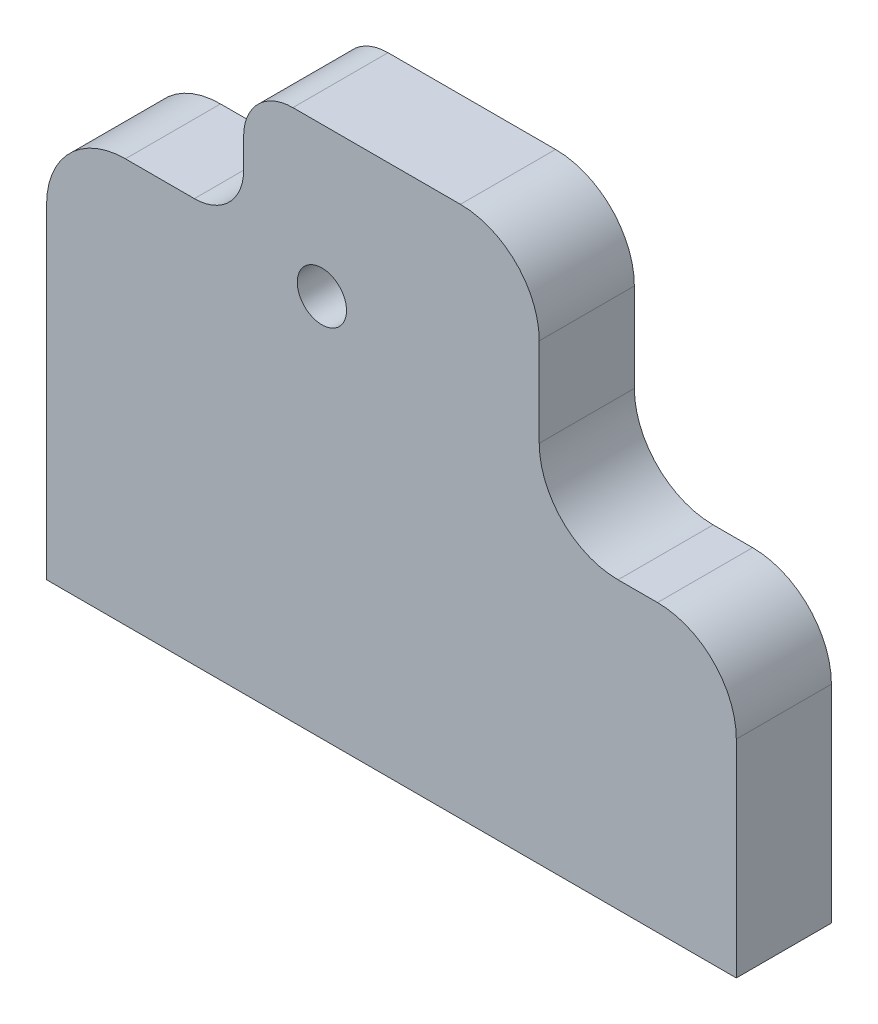
ISO-10303-21;
HEADER;
FILE_DESCRIPTION(('STEP AP214'),'2;1');
FILE_NAME('part.step','',(''),(''),'','','');
FILE_SCHEMA(('AUTOMOTIVE_DESIGN { 1 0 10303 214 1 1 1 1 }'));
ENDSEC;
DATA;
#1=APPLICATION_CONTEXT('core data for automotive mechanical design processes');
#2=APPLICATION_PROTOCOL_DEFINITION('international standard','automotive_design',2000,#1);
#3=PRODUCT_CONTEXT('',#1,'mechanical');
#4=PRODUCT('Part','Part','',(#3));
#5=PRODUCT_RELATED_PRODUCT_CATEGORY('part','',(#4));
#6=PRODUCT_DEFINITION_FORMATION('','',#4);
#7=PRODUCT_DEFINITION_CONTEXT('part definition',#1,'design');
#8=PRODUCT_DEFINITION('design','',#6,#7);
#9=PRODUCT_DEFINITION_SHAPE('','',#8);
#10=(LENGTH_UNIT() NAMED_UNIT(*) SI_UNIT(.MILLI.,.METRE.));
#11=(NAMED_UNIT(*) PLANE_ANGLE_UNIT() SI_UNIT($,.RADIAN.));
#12=(NAMED_UNIT(*) SI_UNIT($,.STERADIAN.) SOLID_ANGLE_UNIT());
#13=UNCERTAINTY_MEASURE_WITH_UNIT(LENGTH_MEASURE(1.E-05),#10,'distance_accuracy_value','');
#14=(GEOMETRIC_REPRESENTATION_CONTEXT(3) GLOBAL_UNCERTAINTY_ASSIGNED_CONTEXT((#13)) GLOBAL_UNIT_ASSIGNED_CONTEXT((#10,
#11,#12)) REPRESENTATION_CONTEXT('',''));
#15=CARTESIAN_POINT('',(0.,0.,0.));
#16=DIRECTION('',(0.,0.,1.));
#17=DIRECTION('',(1.,0.,0.));
#18=AXIS2_PLACEMENT_3D('',#15,#16,#17);
#19=CARTESIAN_POINT('',(16.73,5.,2.413));
#20=DIRECTION('',(0.,-1.,0.));
#21=DIRECTION('',(0.,0.,-1.));
#22=AXIS2_PLACEMENT_3D('',#19,#20,#21);
#23=CONICAL_SURFACE('',#22,1.25,1.02974425867665);
#24=CARTESIAN_POINT('',(16.73,5.75107577378445,2.413));
#25=VERTEX_POINT('',#24);
#26=VERTEX_LOOP('',#25);
#27=FACE_BOUND('',#26,.T.);
#28=CARTESIAN_POINT('',(16.73,5.,2.413));
#29=DIRECTION('',(0.,-1.,0.));
#30=DIRECTION('',(0.,0.,-1.));
#31=AXIS2_PLACEMENT_3D('',#28,#29,#30);
#32=CIRCLE('',#31,1.25);
#33=CARTESIAN_POINT('',(16.73,5.,1.163));
#34=VERTEX_POINT('',#33);
#35=EDGE_CURVE('E200',#34,#34,#32,.T.);
#36=ORIENTED_EDGE('',*,*,#35,.T.);
#37=EDGE_LOOP('',(#36));
#38=FACE_BOUND('',#37,.T.);
#39=ADVANCED_FACE('F49',(#27,#38),#23,.F.);
#40=CARTESIAN_POINT('',(16.73,0.,2.413));
#41=DIRECTION('',(0.,-1.,0.));
#42=DIRECTION('',(0.,0.,-1.));
#43=AXIS2_PLACEMENT_3D('',#40,#41,#42);
#44=CYLINDRICAL_SURFACE('',#43,1.24999999999999);
#45=ORIENTED_EDGE('',*,*,#35,.F.);
#46=EDGE_LOOP('',(#45));
#47=FACE_BOUND('',#46,.T.);
#48=CARTESIAN_POINT('',(16.73,-7.,2.413));
#49=DIRECTION('',(0.,-1.,0.));
#50=DIRECTION('',(1.,0.,0.));
#51=AXIS2_PLACEMENT_3D('',#48,#49,#50);
#52=CIRCLE('',#51,1.24999999999999);
#53=CARTESIAN_POINT('',(17.98,-7.,2.413));
#54=VERTEX_POINT('',#53);
#55=EDGE_CURVE('E192',#54,#54,#52,.T.);
#56=ORIENTED_EDGE('',*,*,#55,.T.);
#57=EDGE_LOOP('',(#56));
#58=FACE_BOUND('',#57,.T.);
#59=ADVANCED_FACE('F383',(#47,#58),#44,.F.);
#60=CARTESIAN_POINT('',(0.,-7.,0.));
#61=DIRECTION('',(0.,1.,0.));
#62=DIRECTION('',(-1.,0.,0.));
#63=AXIS2_PLACEMENT_3D('',#60,#61,#62);
#64=PLANE('',#63);
#65=DIRECTION('',(0.,0.,-1.));
#66=VECTOR('',#65,1.);
#67=CARTESIAN_POINT('',(0.,-7.,0.));
#68=LINE('',#67,#66);
#69=CARTESIAN_POINT('',(0.,-7.,4.826));
#70=VERTEX_POINT('',#69);
#71=CARTESIAN_POINT('',(0.,-7.,0.));
#72=VERTEX_POINT('',#71);
#73=EDGE_CURVE('E163',#70,#72,#68,.T.);
#74=ORIENTED_EDGE('',*,*,#73,.T.);
#75=DIRECTION('',(1.,0.,0.));
#76=VECTOR('',#75,1.);
#77=CARTESIAN_POINT('',(0.,-7.,0.));
#78=LINE('',#77,#76);
#79=CARTESIAN_POINT('',(35.,-7.,0.));
#80=VERTEX_POINT('',#79);
#81=EDGE_CURVE('E172',#72,#80,#78,.T.);
#82=ORIENTED_EDGE('',*,*,#81,.T.);
#83=DIRECTION('',(0.,0.,1.));
#84=VECTOR('',#83,1.);
#85=CARTESIAN_POINT('',(35.,-7.,0.));
#86=LINE('',#85,#84);
#87=CARTESIAN_POINT('',(35.,-7.,4.826));
#88=VERTEX_POINT('',#87);
#89=EDGE_CURVE('E180',#80,#88,#86,.T.);
#90=ORIENTED_EDGE('',*,*,#89,.T.);
#91=DIRECTION('',(-1.,0.,0.));
#92=VECTOR('',#91,1.);
#93=CARTESIAN_POINT('',(0.,-7.,4.826));
#94=LINE('',#93,#92);
#95=EDGE_CURVE('E186',#88,#70,#94,.T.);
#96=ORIENTED_EDGE('',*,*,#95,.T.);
#97=EDGE_LOOP('',(#74,#82,#90,#96));
#98=FACE_BOUND('',#97,.T.);
#99=CARTESIAN_POINT('',(28.73,-7.,2.413));
#100=DIRECTION('',(0.,-1.,0.));
#101=DIRECTION('',(1.,0.,0.));
#102=AXIS2_PLACEMENT_3D('',#99,#100,#101);
#103=CIRCLE('',#102,1.25);
#104=CARTESIAN_POINT('',(29.98,-7.,2.413));
#105=VERTEX_POINT('',#104);
#106=EDGE_CURVE('E188',#105,#105,#103,.T.);
#107=ORIENTED_EDGE('',*,*,#106,.F.);
#108=EDGE_LOOP('',(#107));
#109=FACE_BOUND('',#108,.T.);
#110=ORIENTED_EDGE('',*,*,#55,.F.);
#111=EDGE_LOOP('',(#110));
#112=FACE_BOUND('',#111,.T.);
#113=ADVANCED_FACE('F183',(#98,#109,#112),#64,.F.);
#114=CARTESIAN_POINT('',(0.,13.5,4.826));
#115=DIRECTION('',(0.,1.,0.));
#116=DIRECTION('',(0.,0.,1.));
#117=AXIS2_PLACEMENT_3D('',#114,#115,#116);
#118=PLANE('',#117);
#119=DIRECTION('',(1.,0.,0.));
#120=VECTOR('',#119,1.);
#121=CARTESIAN_POINT('',(0.,13.5,0.));
#122=LINE('',#121,#120);
#123=CARTESIAN_POINT('',(4.,13.5,0.));
#124=VERTEX_POINT('',#123);
#125=CARTESIAN_POINT('',(7.5,13.5,0.));
#126=VERTEX_POINT('',#125);
#127=EDGE_CURVE('E169',#124,#126,#122,.T.);
#128=ORIENTED_EDGE('',*,*,#127,.F.);
#129=DIRECTION('',(0.,0.,-1.));
#130=VECTOR('',#129,1.);
#131=CARTESIAN_POINT('',(4.,13.5,4.826));
#132=LINE('',#131,#130);
#133=CARTESIAN_POINT('',(4.,13.5,4.826));
#134=VERTEX_POINT('',#133);
#135=EDGE_CURVE('E326',#124,#134,#132,.F.);
#136=ORIENTED_EDGE('',*,*,#135,.T.);
#137=DIRECTION('',(1.,0.,0.));
#138=VECTOR('',#137,1.);
#139=CARTESIAN_POINT('',(0.,13.5,4.826));
#140=LINE('',#139,#138);
#141=CARTESIAN_POINT('',(7.5,13.5,4.826));
#142=VERTEX_POINT('',#141);
#143=EDGE_CURVE('E221',#134,#142,#140,.T.);
#144=ORIENTED_EDGE('',*,*,#143,.T.);
#145=DIRECTION('',(0.,0.,-1.));
#146=VECTOR('',#145,1.);
#147=CARTESIAN_POINT('',(7.5,13.5,0.));
#148=LINE('',#147,#146);
#149=EDGE_CURVE('E275',#142,#126,#148,.T.);
#150=ORIENTED_EDGE('',*,*,#149,.T.);
#151=EDGE_LOOP('',(#128,#136,#144,#150));
#152=FACE_BOUND('',#151,.T.);
#153=ADVANCED_FACE('F366',(#152),#118,.T.);
#154=CARTESIAN_POINT('',(7.5,16.,4.826));
#155=DIRECTION('',(0.,0.,1.));
#156=DIRECTION('',(1.,0.,0.));
#157=AXIS2_PLACEMENT_3D('',#154,#155,#156);
#158=CYLINDRICAL_SURFACE('',#157,2.5);
#159=CARTESIAN_POINT('',(7.5,16.,4.826));
#160=DIRECTION('',(0.,0.,1.));
#161=DIRECTION('',(1.,0.,0.));
#162=AXIS2_PLACEMENT_3D('',#159,#160,#161);
#163=CIRCLE('',#162,2.5);
#164=CARTESIAN_POINT('',(10.,16.,4.826));
#165=VERTEX_POINT('',#164);
#166=EDGE_CURVE('E282',#165,#142,#163,.F.);
#167=ORIENTED_EDGE('',*,*,#166,.F.);
#168=DIRECTION('',(0.,0.,-1.));
#169=VECTOR('',#168,1.);
#170=CARTESIAN_POINT('',(10.,16.,4.826));
#171=LINE('',#170,#169);
#172=CARTESIAN_POINT('',(10.,16.,0.));
#173=VERTEX_POINT('',#172);
#174=EDGE_CURVE('E242',#173,#165,#171,.F.);
#175=ORIENTED_EDGE('',*,*,#174,.F.);
#176=CARTESIAN_POINT('',(7.5,16.,0.));
#177=DIRECTION('',(0.,0.,1.));
#178=DIRECTION('',(1.,0.,0.));
#179=AXIS2_PLACEMENT_3D('',#176,#177,#178);
#180=CIRCLE('',#179,2.5);
#181=EDGE_CURVE('E279',#126,#173,#180,.T.);
#182=ORIENTED_EDGE('',*,*,#181,.F.);
#183=ORIENTED_EDGE('',*,*,#149,.F.);
#184=EDGE_LOOP('',(#167,#175,#182,#183));
#185=FACE_BOUND('',#184,.T.);
#186=ADVANCED_FACE('F362',(#185),#158,.F.);
#187=CARTESIAN_POINT('',(10.,0.,4.826));
#188=DIRECTION('',(-1.,0.,0.));
#189=DIRECTION('',(0.,0.,1.));
#190=AXIS2_PLACEMENT_3D('',#187,#188,#189);
#191=PLANE('',#190);
#192=DIRECTION('',(0.,1.,0.));
#193=VECTOR('',#192,1.);
#194=CARTESIAN_POINT('',(10.,0.,4.826));
#195=LINE('',#194,#193);
#196=CARTESIAN_POINT('',(10.,17.5,4.826));
#197=VERTEX_POINT('',#196);
#198=EDGE_CURVE('E217',#165,#197,#195,.T.);
#199=ORIENTED_EDGE('',*,*,#198,.T.);
#200=DIRECTION('',(0.,0.,-1.));
#201=VECTOR('',#200,1.);
#202=CARTESIAN_POINT('',(10.,17.5,4.826));
#203=LINE('',#202,#201);
#204=CARTESIAN_POINT('',(10.,17.5,0.));
#205=VERTEX_POINT('',#204);
#206=EDGE_CURVE('E262',#197,#205,#203,.T.);
#207=ORIENTED_EDGE('',*,*,#206,.T.);
#208=DIRECTION('',(0.,1.,0.));
#209=VECTOR('',#208,1.);
#210=CARTESIAN_POINT('',(10.,0.,0.));
#211=LINE('',#210,#209);
#212=EDGE_CURVE('E216',#173,#205,#211,.T.);
#213=ORIENTED_EDGE('',*,*,#212,.F.);
#214=ORIENTED_EDGE('',*,*,#174,.T.);
#215=EDGE_LOOP('',(#199,#207,#213,#214));
#216=FACE_BOUND('',#215,.T.);
#217=ADVANCED_FACE('F355',(#216),#191,.T.);
#218=CARTESIAN_POINT('',(12.5,17.5,4.826));
#219=DIRECTION('',(0.,0.,-1.));
#220=DIRECTION('',(-1.,0.,0.));
#221=AXIS2_PLACEMENT_3D('',#218,#219,#220);
#222=CYLINDRICAL_SURFACE('',#221,2.5);
#223=CARTESIAN_POINT('',(12.5,17.5,4.826));
#224=DIRECTION('',(0.,0.,1.));
#225=DIRECTION('',(1.,0.,0.));
#226=AXIS2_PLACEMENT_3D('',#223,#224,#225);
#227=CIRCLE('',#226,2.5);
#228=CARTESIAN_POINT('',(12.5,20.,4.826));
#229=VERTEX_POINT('',#228);
#230=EDGE_CURVE('E272',#229,#197,#227,.T.);
#231=ORIENTED_EDGE('',*,*,#230,.F.);
#232=DIRECTION('',(0.,0.,-1.));
#233=VECTOR('',#232,1.);
#234=CARTESIAN_POINT('',(12.5,20.,4.826));
#235=LINE('',#234,#233);
#236=CARTESIAN_POINT('',(12.5,20.,0.));
#237=VERTEX_POINT('',#236);
#238=EDGE_CURVE('E269',#237,#229,#235,.F.);
#239=ORIENTED_EDGE('',*,*,#238,.F.);
#240=CARTESIAN_POINT('',(12.5,17.5,0.));
#241=DIRECTION('',(0.,0.,1.));
#242=DIRECTION('',(1.,0.,0.));
#243=AXIS2_PLACEMENT_3D('',#240,#241,#242);
#244=CIRCLE('',#243,2.5);
#245=EDGE_CURVE('E266',#205,#237,#244,.F.);
#246=ORIENTED_EDGE('',*,*,#245,.F.);
#247=ORIENTED_EDGE('',*,*,#206,.F.);
#248=EDGE_LOOP('',(#231,#239,#246,#247));
#249=FACE_BOUND('',#248,.T.);
#250=ADVANCED_FACE('F353',(#249),#222,.T.);
#251=CARTESIAN_POINT('',(0.,20.,4.826));
#252=DIRECTION('',(0.,1.,0.));
#253=DIRECTION('',(-1.,0.,0.));
#254=AXIS2_PLACEMENT_3D('',#251,#252,#253);
#255=PLANE('',#254);
#256=DIRECTION('',(1.,0.,0.));
#257=VECTOR('',#256,1.);
#258=CARTESIAN_POINT('',(0.,20.,4.826));
#259=LINE('',#258,#257);
#260=CARTESIAN_POINT('',(21.,20.,4.826));
#261=VERTEX_POINT('',#260);
#262=EDGE_CURVE('E238',#229,#261,#259,.T.);
#263=ORIENTED_EDGE('',*,*,#262,.T.);
#264=DIRECTION('',(0.,0.,-1.));
#265=VECTOR('',#264,1.);
#266=CARTESIAN_POINT('',(21.,20.,4.826));
#267=LINE('',#266,#265);
#268=CARTESIAN_POINT('',(21.,20.,0.));
#269=VERTEX_POINT('',#268);
#270=EDGE_CURVE('E320',#261,#269,#267,.T.);
#271=ORIENTED_EDGE('',*,*,#270,.T.);
#272=DIRECTION('',(1.,0.,0.));
#273=VECTOR('',#272,1.);
#274=CARTESIAN_POINT('',(0.,20.,0.));
#275=LINE('',#274,#273);
#276=EDGE_CURVE('E222',#237,#269,#275,.T.);
#277=ORIENTED_EDGE('',*,*,#276,.F.);
#278=ORIENTED_EDGE('',*,*,#238,.T.);
#279=EDGE_LOOP('',(#263,#271,#277,#278));
#280=FACE_BOUND('',#279,.T.);
#281=ADVANCED_FACE('F347',(#280),#255,.T.);
#282=CARTESIAN_POINT('',(21.,16.,4.826));
#283=DIRECTION('',(0.,0.,-1.));
#284=DIRECTION('',(-1.,0.,0.));
#285=AXIS2_PLACEMENT_3D('',#282,#283,#284);
#286=CYLINDRICAL_SURFACE('',#285,4.);
#287=CARTESIAN_POINT('',(21.,16.,4.826));
#288=DIRECTION('',(0.,0.,1.));
#289=DIRECTION('',(1.,0.,0.));
#290=AXIS2_PLACEMENT_3D('',#287,#288,#289);
#291=CIRCLE('',#290,4.);
#292=CARTESIAN_POINT('',(25.,16.,4.826));
#293=VERTEX_POINT('',#292);
#294=EDGE_CURVE('E308',#293,#261,#291,.T.);
#295=ORIENTED_EDGE('',*,*,#294,.F.);
#296=DIRECTION('',(0.,0.,-1.));
#297=VECTOR('',#296,1.);
#298=CARTESIAN_POINT('',(25.,16.,4.826));
#299=LINE('',#298,#297);
#300=CARTESIAN_POINT('',(25.,16.,0.));
#301=VERTEX_POINT('',#300);
#302=EDGE_CURVE('E70',#301,#293,#299,.F.);
#303=ORIENTED_EDGE('',*,*,#302,.F.);
#304=CARTESIAN_POINT('',(21.,16.,0.));
#305=DIRECTION('',(0.,0.,1.));
#306=DIRECTION('',(1.,0.,0.));
#307=AXIS2_PLACEMENT_3D('',#304,#305,#306);
#308=CIRCLE('',#307,4.);
#309=EDGE_CURVE('E296',#269,#301,#308,.F.);
#310=ORIENTED_EDGE('',*,*,#309,.F.);
#311=ORIENTED_EDGE('',*,*,#270,.F.);
#312=EDGE_LOOP('',(#295,#303,#310,#311));
#313=FACE_BOUND('',#312,.T.);
#314=ADVANCED_FACE('F344',(#313),#286,.T.);
#315=CARTESIAN_POINT('',(25.,0.,4.826));
#316=DIRECTION('',(1.,0.,0.));
#317=DIRECTION('',(0.,0.,-1.));
#318=AXIS2_PLACEMENT_3D('',#315,#316,#317);
#319=PLANE('',#318);
#320=DIRECTION('',(0.,-1.,0.));
#321=VECTOR('',#320,1.);
#322=CARTESIAN_POINT('',(25.,0.,4.826));
#323=LINE('',#322,#321);
#324=CARTESIAN_POINT('',(25.,11.5,4.826));
#325=VERTEX_POINT('',#324);
#326=EDGE_CURVE('E235',#293,#325,#323,.T.);
#327=ORIENTED_EDGE('',*,*,#326,.T.);
#328=DIRECTION('',(0.,0.,-1.));
#329=VECTOR('',#328,1.);
#330=CARTESIAN_POINT('',(25.,11.5,0.));
#331=LINE('',#330,#329);
#332=CARTESIAN_POINT('',(25.,11.5,0.));
#333=VERTEX_POINT('',#332);
#334=EDGE_CURVE('E316',#325,#333,#331,.T.);
#335=ORIENTED_EDGE('',*,*,#334,.T.);
#336=DIRECTION('',(0.,-1.,0.));
#337=VECTOR('',#336,1.);
#338=CARTESIAN_POINT('',(25.,0.,0.));
#339=LINE('',#338,#337);
#340=EDGE_CURVE('E253',#301,#333,#339,.T.);
#341=ORIENTED_EDGE('',*,*,#340,.F.);
#342=ORIENTED_EDGE('',*,*,#302,.T.);
#343=EDGE_LOOP('',(#327,#335,#341,#342));
#344=FACE_BOUND('',#343,.T.);
#345=ADVANCED_FACE('F337',(#344),#319,.T.);
#346=CARTESIAN_POINT('',(29.,11.5,4.826));
#347=DIRECTION('',(0.,0.,1.));
#348=DIRECTION('',(1.,0.,0.));
#349=AXIS2_PLACEMENT_3D('',#346,#347,#348);
#350=CYLINDRICAL_SURFACE('',#349,4.);
#351=CARTESIAN_POINT('',(29.,11.5,4.826));
#352=DIRECTION('',(0.,0.,1.));
#353=DIRECTION('',(1.,0.,0.));
#354=AXIS2_PLACEMENT_3D('',#351,#352,#353);
#355=CIRCLE('',#354,4.);
#356=CARTESIAN_POINT('',(29.,7.5,4.826));
#357=VERTEX_POINT('',#356);
#358=EDGE_CURVE('E11',#357,#325,#355,.F.);
#359=ORIENTED_EDGE('',*,*,#358,.F.);
#360=DIRECTION('',(0.,0.,-1.));
#361=VECTOR('',#360,1.);
#362=CARTESIAN_POINT('',(29.,7.5,4.826));
#363=LINE('',#362,#361);
#364=CARTESIAN_POINT('',(29.,7.5,0.));
#365=VERTEX_POINT('',#364);
#366=EDGE_CURVE('E286',#365,#357,#363,.F.);
#367=ORIENTED_EDGE('',*,*,#366,.F.);
#368=CARTESIAN_POINT('',(29.,11.5,0.));
#369=DIRECTION('',(0.,0.,1.));
#370=DIRECTION('',(1.,0.,0.));
#371=AXIS2_PLACEMENT_3D('',#368,#369,#370);
#372=CIRCLE('',#371,4.);
#373=EDGE_CURVE('E58',#333,#365,#372,.T.);
#374=ORIENTED_EDGE('',*,*,#373,.F.);
#375=ORIENTED_EDGE('',*,*,#334,.F.);
#376=EDGE_LOOP('',(#359,#367,#374,#375));
#377=FACE_BOUND('',#376,.T.);
#378=ADVANCED_FACE('F336',(#377),#350,.F.);
#379=CARTESIAN_POINT('',(0.,7.5,4.826));
#380=DIRECTION('',(0.,1.,0.));
#381=DIRECTION('',(0.,0.,1.));
#382=AXIS2_PLACEMENT_3D('',#379,#380,#381);
#383=PLANE('',#382);
#384=DIRECTION('',(1.,0.,0.));
#385=VECTOR('',#384,1.);
#386=CARTESIAN_POINT('',(0.,7.5,4.826));
#387=LINE('',#386,#385);
#388=CARTESIAN_POINT('',(31.,7.5,4.826));
#389=VERTEX_POINT('',#388);
#390=EDGE_CURVE('E231',#357,#389,#387,.T.);
#391=ORIENTED_EDGE('',*,*,#390,.T.);
#392=DIRECTION('',(0.,0.,-1.));
#393=VECTOR('',#392,1.);
#394=CARTESIAN_POINT('',(31.,7.5,4.826));
#395=LINE('',#394,#393);
#396=CARTESIAN_POINT('',(31.,7.5,0.));
#397=VERTEX_POINT('',#396);
#398=EDGE_CURVE('E289',#389,#397,#395,.T.);
#399=ORIENTED_EDGE('',*,*,#398,.T.);
#400=DIRECTION('',(1.,0.,0.));
#401=VECTOR('',#400,1.);
#402=CARTESIAN_POINT('',(0.,7.5,0.));
#403=LINE('',#402,#401);
#404=EDGE_CURVE('E250',#365,#397,#403,.T.);
#405=ORIENTED_EDGE('',*,*,#404,.F.);
#406=ORIENTED_EDGE('',*,*,#366,.T.);
#407=EDGE_LOOP('',(#391,#399,#405,#406));
#408=FACE_BOUND('',#407,.T.);
#409=ADVANCED_FACE('F334',(#408),#383,.T.);
#410=CARTESIAN_POINT('',(31.,3.5,4.826));
#411=DIRECTION('',(0.,0.,-1.));
#412=DIRECTION('',(-1.,0.,0.));
#413=AXIS2_PLACEMENT_3D('',#410,#411,#412);
#414=CYLINDRICAL_SURFACE('',#413,4.);
#415=CARTESIAN_POINT('',(31.,3.5,4.826));
#416=DIRECTION('',(0.,0.,1.));
#417=DIRECTION('',(1.,0.,0.));
#418=AXIS2_PLACEMENT_3D('',#415,#416,#417);
#419=CIRCLE('',#418,4.);
#420=CARTESIAN_POINT('',(35.,3.5,4.826));
#421=VERTEX_POINT('',#420);
#422=EDGE_CURVE('E311',#421,#389,#419,.T.);
#423=ORIENTED_EDGE('',*,*,#422,.F.);
#424=DIRECTION('',(0.,0.,-1.));
#425=VECTOR('',#424,1.);
#426=CARTESIAN_POINT('',(35.,3.5,4.826));
#427=LINE('',#426,#425);
#428=CARTESIAN_POINT('',(35.,3.5,0.));
#429=VERTEX_POINT('',#428);
#430=EDGE_CURVE('E302',#429,#421,#427,.F.);
#431=ORIENTED_EDGE('',*,*,#430,.F.);
#432=CARTESIAN_POINT('',(31.,3.5,0.));
#433=DIRECTION('',(0.,0.,1.));
#434=DIRECTION('',(1.,0.,0.));
#435=AXIS2_PLACEMENT_3D('',#432,#433,#434);
#436=CIRCLE('',#435,4.);
#437=EDGE_CURVE('E299',#397,#429,#436,.F.);
#438=ORIENTED_EDGE('',*,*,#437,.F.);
#439=ORIENTED_EDGE('',*,*,#398,.F.);
#440=EDGE_LOOP('',(#423,#431,#438,#439));
#441=FACE_BOUND('',#440,.T.);
#442=ADVANCED_FACE('F379',(#441),#414,.T.);
#443=CARTESIAN_POINT('',(13.97024649,12.44,4.826));
#444=DIRECTION('',(0.,0.,1.));
#445=DIRECTION('',(1.,0.,0.));
#446=AXIS2_PLACEMENT_3D('',#443,#444,#445);
#447=CYLINDRICAL_SURFACE('',#446,1.24999999999999);
#448=CARTESIAN_POINT('',(13.97024649,12.44,0.));
#449=DIRECTION('',(0.,0.,1.));
#450=DIRECTION('',(1.,0.,0.));
#451=AXIS2_PLACEMENT_3D('',#448,#449,#450);
#452=CIRCLE('',#451,1.25);
#453=CARTESIAN_POINT('',(15.22024649,12.44,0.));
#454=VERTEX_POINT('',#453);
#455=EDGE_CURVE('E212',#454,#454,#452,.T.);
#456=ORIENTED_EDGE('',*,*,#455,.F.);
#457=EDGE_LOOP('',(#456));
#458=FACE_BOUND('',#457,.T.);
#459=CARTESIAN_POINT('',(13.97024649,12.44,4.826));
#460=DIRECTION('',(0.,0.,1.));
#461=DIRECTION('',(1.,0.,0.));
#462=AXIS2_PLACEMENT_3D('',#459,#460,#461);
#463=CIRCLE('',#462,1.24999999999999);
#464=CARTESIAN_POINT('',(15.22024649,12.44,4.826));
#465=VERTEX_POINT('',#464);
#466=EDGE_CURVE('E208',#465,#465,#463,.T.);
#467=ORIENTED_EDGE('',*,*,#466,.T.);
#468=EDGE_LOOP('',(#467));
#469=FACE_BOUND('',#468,.T.);
#470=ADVANCED_FACE('F371',(#458,#469),#447,.F.);
#471=CARTESIAN_POINT('',(4.,9.5,4.826));
#472=DIRECTION('',(0.,0.,-1.));
#473=DIRECTION('',(-1.,0.,0.));
#474=AXIS2_PLACEMENT_3D('',#471,#472,#473);
#475=CYLINDRICAL_SURFACE('',#474,4.);
#476=CARTESIAN_POINT('',(4.,9.5,4.826));
#477=DIRECTION('',(0.,0.,1.));
#478=DIRECTION('',(1.,0.,0.));
#479=AXIS2_PLACEMENT_3D('',#476,#477,#478);
#480=CIRCLE('',#479,4.);
#481=CARTESIAN_POINT('',(0.,9.5,4.826));
#482=VERTEX_POINT('',#481);
#483=EDGE_CURVE('E305',#134,#482,#480,.T.);
#484=ORIENTED_EDGE('',*,*,#483,.F.);
#485=ORIENTED_EDGE('',*,*,#135,.F.);
#486=CARTESIAN_POINT('',(4.,9.5,0.));
#487=DIRECTION('',(0.,0.,1.));
#488=DIRECTION('',(1.,0.,0.));
#489=AXIS2_PLACEMENT_3D('',#486,#487,#488);
#490=CIRCLE('',#489,4.);
#491=CARTESIAN_POINT('',(0.,9.5,0.));
#492=VERTEX_POINT('',#491);
#493=EDGE_CURVE('E293',#492,#124,#490,.F.);
#494=ORIENTED_EDGE('',*,*,#493,.F.);
#495=DIRECTION('',(0.,0.,-1.));
#496=VECTOR('',#495,1.);
#497=CARTESIAN_POINT('',(0.,9.5,4.826));
#498=LINE('',#497,#496);
#499=EDGE_CURVE('E165',#482,#492,#498,.T.);
#500=ORIENTED_EDGE('',*,*,#499,.F.);
#501=EDGE_LOOP('',(#484,#485,#494,#500));
#502=FACE_BOUND('',#501,.T.);
#503=ADVANCED_FACE('F51',(#502),#475,.T.);
#504=CARTESIAN_POINT('',(0.,0.,4.826));
#505=DIRECTION('',(-1.,0.,0.));
#506=DIRECTION('',(0.,0.,1.));
#507=AXIS2_PLACEMENT_3D('',#504,#505,#506);
#508=PLANE('',#507);
#509=DIRECTION('',(0.,1.,0.));
#510=VECTOR('',#509,1.);
#511=CARTESIAN_POINT('',(0.,0.,4.826));
#512=LINE('',#511,#510);
#513=EDGE_CURVE('E225',#70,#482,#512,.T.);
#514=ORIENTED_EDGE('',*,*,#513,.T.);
#515=ORIENTED_EDGE('',*,*,#499,.T.);
#516=DIRECTION('',(0.,1.,0.));
#517=VECTOR('',#516,1.);
#518=CARTESIAN_POINT('',(0.,0.,0.));
#519=LINE('',#518,#517);
#520=EDGE_CURVE('E158',#72,#492,#519,.T.);
#521=ORIENTED_EDGE('',*,*,#520,.F.);
#522=ORIENTED_EDGE('',*,*,#73,.F.);
#523=EDGE_LOOP('',(#514,#515,#521,#522));
#524=FACE_BOUND('',#523,.T.);
#525=ADVANCED_FACE('F161',(#524),#508,.T.);
#526=CARTESIAN_POINT('',(0.,0.,4.826));
#527=DIRECTION('',(0.,0.,1.));
#528=DIRECTION('',(1.,0.,0.));
#529=AXIS2_PLACEMENT_3D('',#526,#527,#528);
#530=PLANE('',#529);
#531=ORIENTED_EDGE('',*,*,#466,.F.);
#532=EDGE_LOOP('',(#531));
#533=FACE_BOUND('',#532,.T.);
#534=DIRECTION('',(0.,-1.,0.));
#535=VECTOR('',#534,1.);
#536=CARTESIAN_POINT('',(35.,0.,4.826));
#537=LINE('',#536,#535);
#538=EDGE_CURVE('E228',#421,#88,#537,.T.);
#539=ORIENTED_EDGE('',*,*,#538,.F.);
#540=ORIENTED_EDGE('',*,*,#422,.T.);
#541=ORIENTED_EDGE('',*,*,#390,.F.);
#542=ORIENTED_EDGE('',*,*,#358,.T.);
#543=ORIENTED_EDGE('',*,*,#326,.F.);
#544=ORIENTED_EDGE('',*,*,#294,.T.);
#545=ORIENTED_EDGE('',*,*,#262,.F.);
#546=ORIENTED_EDGE('',*,*,#230,.T.);
#547=ORIENTED_EDGE('',*,*,#198,.F.);
#548=ORIENTED_EDGE('',*,*,#166,.T.);
#549=ORIENTED_EDGE('',*,*,#143,.F.);
#550=ORIENTED_EDGE('',*,*,#483,.T.);
#551=ORIENTED_EDGE('',*,*,#513,.F.);
#552=ORIENTED_EDGE('',*,*,#95,.F.);
#553=EDGE_LOOP('',(#539,#540,#541,#542,#543,#544,#545,#546,#547,#548,#549,#550,#551,#552));
#554=FACE_BOUND('',#553,.T.);
#555=ADVANCED_FACE('F340',(#533,#554),#530,.T.);
#556=CARTESIAN_POINT('',(35.,0.,4.826));
#557=DIRECTION('',(1.,0.,0.));
#558=DIRECTION('',(0.,0.,-1.));
#559=AXIS2_PLACEMENT_3D('',#556,#557,#558);
#560=PLANE('',#559);
#561=DIRECTION('',(0.,-1.,0.));
#562=VECTOR('',#561,1.);
#563=CARTESIAN_POINT('',(35.,0.,0.));
#564=LINE('',#563,#562);
#565=EDGE_CURVE('E168',#429,#80,#564,.T.);
#566=ORIENTED_EDGE('',*,*,#565,.F.);
#567=ORIENTED_EDGE('',*,*,#430,.T.);
#568=ORIENTED_EDGE('',*,*,#538,.T.);
#569=ORIENTED_EDGE('',*,*,#89,.F.);
#570=EDGE_LOOP('',(#566,#567,#568,#569));
#571=FACE_BOUND('',#570,.T.);
#572=ADVANCED_FACE('F404',(#571),#560,.T.);
#573=CARTESIAN_POINT('',(0.,0.,0.));
#574=DIRECTION('',(0.,0.,1.));
#575=DIRECTION('',(1.,0.,0.));
#576=AXIS2_PLACEMENT_3D('',#573,#574,#575);
#577=PLANE('',#576);
#578=ORIENTED_EDGE('',*,*,#455,.T.);
#579=EDGE_LOOP('',(#578));
#580=FACE_BOUND('',#579,.T.);
#581=ORIENTED_EDGE('',*,*,#404,.T.);
#582=ORIENTED_EDGE('',*,*,#437,.T.);
#583=ORIENTED_EDGE('',*,*,#565,.T.);
#584=ORIENTED_EDGE('',*,*,#81,.F.);
#585=ORIENTED_EDGE('',*,*,#520,.T.);
#586=ORIENTED_EDGE('',*,*,#493,.T.);
#587=ORIENTED_EDGE('',*,*,#127,.T.);
#588=ORIENTED_EDGE('',*,*,#181,.T.);
#589=ORIENTED_EDGE('',*,*,#212,.T.);
#590=ORIENTED_EDGE('',*,*,#245,.T.);
#591=ORIENTED_EDGE('',*,*,#276,.T.);
#592=ORIENTED_EDGE('',*,*,#309,.T.);
#593=ORIENTED_EDGE('',*,*,#340,.T.);
#594=ORIENTED_EDGE('',*,*,#373,.T.);
#595=EDGE_LOOP('',(#581,#582,#583,#584,#585,#586,#587,#588,#589,#590,#591,#592,#593,#594));
#596=FACE_BOUND('',#595,.T.);
#597=ADVANCED_FACE('F174',(#580,#596),#577,.F.);
#598=CARTESIAN_POINT('',(28.73,5.,2.413));
#599=DIRECTION('',(0.,-1.,0.));
#600=DIRECTION('',(0.,0.,-1.));
#601=AXIS2_PLACEMENT_3D('',#598,#599,#600);
#602=CONICAL_SURFACE('',#601,1.25,1.02974425867665);
#603=CARTESIAN_POINT('',(28.73,5.75107577378445,2.413));
#604=VERTEX_POINT('',#603);
#605=VERTEX_LOOP('',#604);
#606=FACE_BOUND('',#605,.T.);
#607=CARTESIAN_POINT('',(28.73,5.,2.413));
#608=DIRECTION('',(0.,-1.,0.));
#609=DIRECTION('',(0.,0.,-1.));
#610=AXIS2_PLACEMENT_3D('',#607,#608,#609);
#611=CIRCLE('',#610,1.25);
#612=CARTESIAN_POINT('',(28.73,5.,1.163));
#613=VERTEX_POINT('',#612);
#614=EDGE_CURVE('E204',#613,#613,#611,.T.);
#615=ORIENTED_EDGE('',*,*,#614,.T.);
#616=EDGE_LOOP('',(#615));
#617=FACE_BOUND('',#616,.T.);
#618=ADVANCED_FACE('F398',(#606,#617),#602,.F.);
#619=CARTESIAN_POINT('',(28.73,0.,2.413));
#620=DIRECTION('',(0.,-1.,0.));
#621=DIRECTION('',(0.,0.,-1.));
#622=AXIS2_PLACEMENT_3D('',#619,#620,#621);
#623=CYLINDRICAL_SURFACE('',#622,1.24999999999999);
#624=ORIENTED_EDGE('',*,*,#614,.F.);
#625=EDGE_LOOP('',(#624));
#626=FACE_BOUND('',#625,.T.);
#627=ORIENTED_EDGE('',*,*,#106,.T.);
#628=EDGE_LOOP('',(#627));
#629=FACE_BOUND('',#628,.T.);
#630=ADVANCED_FACE('F395',(#626,#629),#623,.F.);
#631=CLOSED_SHELL('',(#39,#59,#113,#153,#186,#217,#250,#281,#314,#345,#378,#409,#442,#470,#503,
#525,#555,#572,#597,#618,#630));
#632=MANIFOLD_SOLID_BREP('B2',#631);
#633=ADVANCED_BREP_SHAPE_REPRESENTATION('',(#18,#632),#14);
#634=SHAPE_DEFINITION_REPRESENTATION(#9,#633);
ENDSEC;
END-ISO-10303-21;
